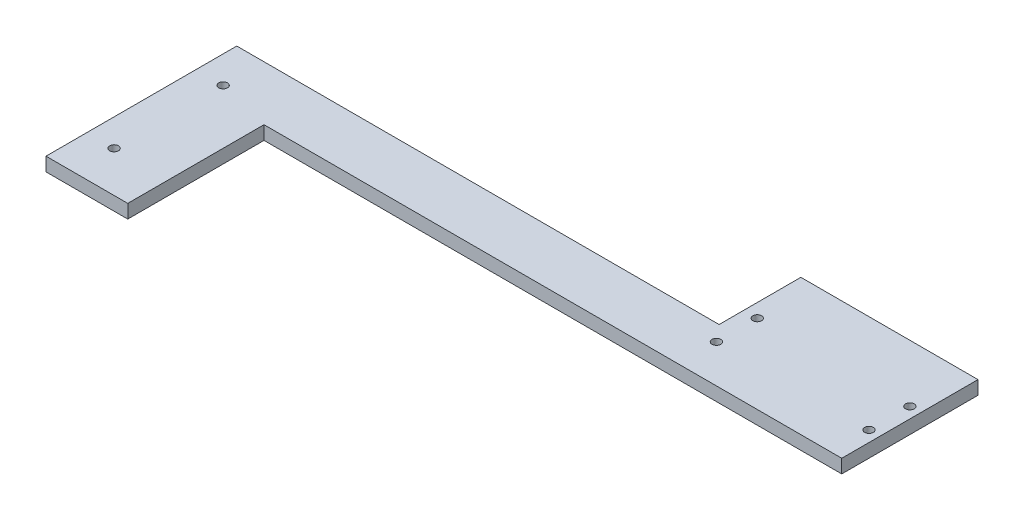
ISO-10303-21;
HEADER;
FILE_DESCRIPTION(('STEP AP214'),'2;1');
FILE_NAME('part.step','',(''),(''),'','','');
FILE_SCHEMA(('AUTOMOTIVE_DESIGN { 1 0 10303 214 1 1 1 1 }'));
ENDSEC;
DATA;
#1=APPLICATION_CONTEXT('core data for automotive mechanical design processes');
#2=APPLICATION_PROTOCOL_DEFINITION('international standard','automotive_design',2000,#1);
#3=PRODUCT_CONTEXT('',#1,'mechanical');
#4=PRODUCT('Part','Part','',(#3));
#5=PRODUCT_RELATED_PRODUCT_CATEGORY('part','',(#4));
#6=PRODUCT_DEFINITION_FORMATION('','',#4);
#7=PRODUCT_DEFINITION_CONTEXT('part definition',#1,'design');
#8=PRODUCT_DEFINITION('design','',#6,#7);
#9=PRODUCT_DEFINITION_SHAPE('','',#8);
#10=(LENGTH_UNIT() NAMED_UNIT(*) SI_UNIT(.MILLI.,.METRE.));
#11=(NAMED_UNIT(*) PLANE_ANGLE_UNIT() SI_UNIT($,.RADIAN.));
#12=(NAMED_UNIT(*) SI_UNIT($,.STERADIAN.) SOLID_ANGLE_UNIT());
#13=UNCERTAINTY_MEASURE_WITH_UNIT(LENGTH_MEASURE(1.E-05),#10,'distance_accuracy_value','');
#14=(GEOMETRIC_REPRESENTATION_CONTEXT(3) GLOBAL_UNCERTAINTY_ASSIGNED_CONTEXT((#13)) GLOBAL_UNIT_ASSIGNED_CONTEXT((#10,
#11,#12)) REPRESENTATION_CONTEXT('',''));
#15=CARTESIAN_POINT('',(0.,0.,0.));
#16=DIRECTION('',(0.,0.,1.));
#17=DIRECTION('',(1.,0.,0.));
#18=AXIS2_PLACEMENT_3D('',#15,#16,#17);
#19=CARTESIAN_POINT('',(0.,5.,0.));
#20=DIRECTION('',(0.,1.,0.));
#21=DIRECTION('',(0.,0.,1.));
#22=AXIS2_PLACEMENT_3D('',#19,#20,#21);
#23=PLANE('',#22);
#24=CARTESIAN_POINT('',(228.,5.,-29.));
#25=DIRECTION('',(0.,1.,0.));
#26=DIRECTION('',(0.,0.,1.));
#27=AXIS2_PLACEMENT_3D('',#24,#25,#26);
#28=CIRCLE('',#27,1.59999999999999);
#29=CARTESIAN_POINT('',(228.,5.,-27.4));
#30=VERTEX_POINT('',#29);
#31=EDGE_CURVE('E206',#30,#30,#28,.T.);
#32=ORIENTED_EDGE('',*,*,#31,.F.);
#33=EDGE_LOOP('',(#32));
#34=FACE_BOUND('',#33,.T.);
#35=CARTESIAN_POINT('',(0.,5.,-20.));
#36=DIRECTION('',(0.,1.,0.));
#37=DIRECTION('',(0.,0.,-1.));
#38=AXIS2_PLACEMENT_3D('',#35,#36,#37);
#39=CIRCLE('',#38,1.6);
#40=CARTESIAN_POINT('',(0.,5.,-21.6));
#41=VERTEX_POINT('',#40);
#42=EDGE_CURVE('E194',#41,#41,#39,.T.);
#43=ORIENTED_EDGE('',*,*,#42,.F.);
#44=EDGE_LOOP('',(#43));
#45=FACE_BOUND('',#44,.T.);
#46=CARTESIAN_POINT('',(0.,5.,20.));
#47=DIRECTION('',(0.,1.,0.));
#48=DIRECTION('',(0.,0.,1.));
#49=AXIS2_PLACEMENT_3D('',#46,#47,#48);
#50=CIRCLE('',#49,1.6);
#51=CARTESIAN_POINT('',(0.,5.,21.6));
#52=VERTEX_POINT('',#51);
#53=EDGE_CURVE('E136',#52,#52,#50,.T.);
#54=ORIENTED_EDGE('',*,*,#53,.F.);
#55=EDGE_LOOP('',(#54));
#56=FACE_BOUND('',#55,.T.);
#57=DIRECTION('',(-1.,0.,0.));
#58=VECTOR('',#57,1.);
#59=CARTESIAN_POINT('',(0.,5.,-35.));
#60=LINE('',#59,#58);
#61=CARTESIAN_POINT('',(167.,5.,-35.));
#62=VERTEX_POINT('',#61);
#63=CARTESIAN_POINT('',(-9.99999999999998,5.,-35.));
#64=VERTEX_POINT('',#63);
#65=EDGE_CURVE('E96',#62,#64,#60,.T.);
#66=ORIENTED_EDGE('',*,*,#65,.T.);
#67=DIRECTION('',(0.,0.,1.));
#68=VECTOR('',#67,1.);
#69=CARTESIAN_POINT('',(-9.99999999999998,5.,-35.));
#70=LINE('',#69,#68);
#71=CARTESIAN_POINT('',(-9.99999999999998,5.,35.));
#72=VERTEX_POINT('',#71);
#73=EDGE_CURVE('E169',#64,#72,#70,.T.);
#74=ORIENTED_EDGE('',*,*,#73,.T.);
#75=DIRECTION('',(1.,0.,0.));
#76=VECTOR('',#75,1.);
#77=CARTESIAN_POINT('',(-9.99999999999998,5.,35.));
#78=LINE('',#77,#76);
#79=CARTESIAN_POINT('',(20.,5.,35.));
#80=VERTEX_POINT('',#79);
#81=EDGE_CURVE('E165',#72,#80,#78,.T.);
#82=ORIENTED_EDGE('',*,*,#81,.T.);
#83=DIRECTION('',(0.,0.,-1.));
#84=VECTOR('',#83,1.);
#85=CARTESIAN_POINT('',(20.,5.,35.));
#86=LINE('',#85,#84);
#87=CARTESIAN_POINT('',(20.,5.,-15.));
#88=VERTEX_POINT('',#87);
#89=EDGE_CURVE('E179',#80,#88,#86,.T.);
#90=ORIENTED_EDGE('',*,*,#89,.T.);
#91=DIRECTION('',(1.,0.,0.));
#92=VECTOR('',#91,1.);
#93=CARTESIAN_POINT('',(20.,5.,-15.));
#94=LINE('',#93,#92);
#95=CARTESIAN_POINT('',(232.,5.,-15.));
#96=VERTEX_POINT('',#95);
#97=EDGE_CURVE('E116',#88,#96,#94,.T.);
#98=ORIENTED_EDGE('',*,*,#97,.T.);
#99=DIRECTION('',(0.,0.,-1.));
#100=VECTOR('',#99,1.);
#101=CARTESIAN_POINT('',(232.,5.,-15.));
#102=LINE('',#101,#100);
#103=CARTESIAN_POINT('',(232.,5.,-65.));
#104=VERTEX_POINT('',#103);
#105=EDGE_CURVE('E110',#96,#104,#102,.T.);
#106=ORIENTED_EDGE('',*,*,#105,.T.);
#107=DIRECTION('',(-1.,0.,0.));
#108=VECTOR('',#107,1.);
#109=CARTESIAN_POINT('',(167.,5.,-65.));
#110=LINE('',#109,#108);
#111=CARTESIAN_POINT('',(167.,5.,-65.));
#112=VERTEX_POINT('',#111);
#113=EDGE_CURVE('E114',#104,#112,#110,.T.);
#114=ORIENTED_EDGE('',*,*,#113,.T.);
#115=DIRECTION('',(0.,0.,1.));
#116=VECTOR('',#115,1.);
#117=CARTESIAN_POINT('',(167.,5.,-35.));
#118=LINE('',#117,#116);
#119=EDGE_CURVE('E54',#112,#62,#118,.T.);
#120=ORIENTED_EDGE('',*,*,#119,.T.);
#121=EDGE_LOOP('',(#66,#74,#82,#90,#98,#106,#114,#120));
#122=FACE_BOUND('',#121,.T.);
#123=CARTESIAN_POINT('',(172.,5.,-29.));
#124=DIRECTION('',(0.,1.,0.));
#125=DIRECTION('',(0.,0.,1.));
#126=AXIS2_PLACEMENT_3D('',#123,#124,#125);
#127=CIRCLE('',#126,1.59999999999999);
#128=CARTESIAN_POINT('',(172.,5.,-27.4));
#129=VERTEX_POINT('',#128);
#130=EDGE_CURVE('E188',#129,#129,#127,.T.);
#131=ORIENTED_EDGE('',*,*,#130,.F.);
#132=EDGE_LOOP('',(#131));
#133=FACE_BOUND('',#132,.T.);
#134=CARTESIAN_POINT('',(172.,5.,-44.));
#135=DIRECTION('',(0.,1.,0.));
#136=DIRECTION('',(0.,0.,1.));
#137=AXIS2_PLACEMENT_3D('',#134,#135,#136);
#138=CIRCLE('',#137,1.59999999999999);
#139=CARTESIAN_POINT('',(172.,5.,-42.4));
#140=VERTEX_POINT('',#139);
#141=EDGE_CURVE('E200',#140,#140,#138,.T.);
#142=ORIENTED_EDGE('',*,*,#141,.F.);
#143=EDGE_LOOP('',(#142));
#144=FACE_BOUND('',#143,.T.);
#145=CARTESIAN_POINT('',(228.,5.,-44.));
#146=DIRECTION('',(0.,1.,0.));
#147=DIRECTION('',(0.,0.,1.));
#148=AXIS2_PLACEMENT_3D('',#145,#146,#147);
#149=CIRCLE('',#148,1.59999999999999);
#150=CARTESIAN_POINT('',(228.,5.,-42.4));
#151=VERTEX_POINT('',#150);
#152=EDGE_CURVE('E212',#151,#151,#149,.T.);
#153=ORIENTED_EDGE('',*,*,#152,.F.);
#154=EDGE_LOOP('',(#153));
#155=FACE_BOUND('',#154,.T.);
#156=ADVANCED_FACE('F37',(#34,#45,#56,#122,#133,#144,#155),#23,.T.);
#157=CARTESIAN_POINT('',(0.,0.,0.));
#158=DIRECTION('',(0.,1.,0.));
#159=DIRECTION('',(0.,0.,1.));
#160=AXIS2_PLACEMENT_3D('',#157,#158,#159);
#161=PLANE('',#160);
#162=DIRECTION('',(-1.,0.,0.));
#163=VECTOR('',#162,1.);
#164=CARTESIAN_POINT('',(-9.99999999999998,0.,-35.));
#165=LINE('',#164,#163);
#166=CARTESIAN_POINT('',(167.,0.,-35.));
#167=VERTEX_POINT('',#166);
#168=CARTESIAN_POINT('',(-9.99999999999998,0.,-35.));
#169=VERTEX_POINT('',#168);
#170=EDGE_CURVE('E90',#167,#169,#165,.T.);
#171=ORIENTED_EDGE('',*,*,#170,.F.);
#172=DIRECTION('',(0.,0.,1.));
#173=VECTOR('',#172,1.);
#174=CARTESIAN_POINT('',(167.,0.,-35.));
#175=LINE('',#174,#173);
#176=CARTESIAN_POINT('',(167.,0.,-65.));
#177=VERTEX_POINT('',#176);
#178=EDGE_CURVE('E148',#177,#167,#175,.T.);
#179=ORIENTED_EDGE('',*,*,#178,.F.);
#180=DIRECTION('',(-1.,0.,0.));
#181=VECTOR('',#180,1.);
#182=CARTESIAN_POINT('',(167.,0.,-65.));
#183=LINE('',#182,#181);
#184=CARTESIAN_POINT('',(232.,0.,-65.));
#185=VERTEX_POINT('',#184);
#186=EDGE_CURVE('E83',#185,#177,#183,.T.);
#187=ORIENTED_EDGE('',*,*,#186,.F.);
#188=DIRECTION('',(0.,0.,-1.));
#189=VECTOR('',#188,1.);
#190=CARTESIAN_POINT('',(232.,0.,-15.));
#191=LINE('',#190,#189);
#192=CARTESIAN_POINT('',(232.,0.,-15.));
#193=VERTEX_POINT('',#192);
#194=EDGE_CURVE('E124',#193,#185,#191,.T.);
#195=ORIENTED_EDGE('',*,*,#194,.F.);
#196=DIRECTION('',(1.,0.,0.));
#197=VECTOR('',#196,1.);
#198=CARTESIAN_POINT('',(20.,0.,-15.));
#199=LINE('',#198,#197);
#200=CARTESIAN_POINT('',(20.,0.,-15.));
#201=VERTEX_POINT('',#200);
#202=EDGE_CURVE('E144',#201,#193,#199,.T.);
#203=ORIENTED_EDGE('',*,*,#202,.F.);
#204=DIRECTION('',(0.,0.,-1.));
#205=VECTOR('',#204,1.);
#206=CARTESIAN_POINT('',(20.,0.,0.));
#207=LINE('',#206,#205);
#208=CARTESIAN_POINT('',(20.,0.,35.));
#209=VERTEX_POINT('',#208);
#210=EDGE_CURVE('E142',#209,#201,#207,.T.);
#211=ORIENTED_EDGE('',*,*,#210,.F.);
#212=DIRECTION('',(1.,0.,0.));
#213=VECTOR('',#212,1.);
#214=CARTESIAN_POINT('',(0.,0.,35.));
#215=LINE('',#214,#213);
#216=CARTESIAN_POINT('',(-9.99999999999998,0.,35.));
#217=VERTEX_POINT('',#216);
#218=EDGE_CURVE('E139',#217,#209,#215,.T.);
#219=ORIENTED_EDGE('',*,*,#218,.F.);
#220=DIRECTION('',(0.,0.,1.));
#221=VECTOR('',#220,1.);
#222=CARTESIAN_POINT('',(-9.99999999999998,0.,-35.));
#223=LINE('',#222,#221);
#224=EDGE_CURVE('E135',#169,#217,#223,.T.);
#225=ORIENTED_EDGE('',*,*,#224,.F.);
#226=EDGE_LOOP('',(#171,#179,#187,#195,#203,#211,#219,#225));
#227=FACE_BOUND('',#226,.T.);
#228=CARTESIAN_POINT('',(0.,0.,20.));
#229=DIRECTION('',(0.,1.,0.));
#230=DIRECTION('',(0.,0.,1.));
#231=AXIS2_PLACEMENT_3D('',#228,#229,#230);
#232=CIRCLE('',#231,1.6);
#233=CARTESIAN_POINT('',(0.,0.,21.6));
#234=VERTEX_POINT('',#233);
#235=EDGE_CURVE('E185',#234,#234,#232,.T.);
#236=ORIENTED_EDGE('',*,*,#235,.T.);
#237=EDGE_LOOP('',(#236));
#238=FACE_BOUND('',#237,.T.);
#239=CARTESIAN_POINT('',(172.,0.,-29.));
#240=DIRECTION('',(0.,1.,0.));
#241=DIRECTION('',(0.,0.,1.));
#242=AXIS2_PLACEMENT_3D('',#239,#240,#241);
#243=CIRCLE('',#242,1.59999999999999);
#244=CARTESIAN_POINT('',(172.,0.,-27.4));
#245=VERTEX_POINT('',#244);
#246=EDGE_CURVE('E191',#245,#245,#243,.T.);
#247=ORIENTED_EDGE('',*,*,#246,.T.);
#248=EDGE_LOOP('',(#247));
#249=FACE_BOUND('',#248,.T.);
#250=CARTESIAN_POINT('',(0.,0.,-20.));
#251=DIRECTION('',(0.,1.,0.));
#252=DIRECTION('',(0.,0.,-1.));
#253=AXIS2_PLACEMENT_3D('',#250,#251,#252);
#254=CIRCLE('',#253,1.6);
#255=CARTESIAN_POINT('',(0.,0.,-21.6));
#256=VERTEX_POINT('',#255);
#257=EDGE_CURVE('E197',#256,#256,#254,.T.);
#258=ORIENTED_EDGE('',*,*,#257,.T.);
#259=EDGE_LOOP('',(#258));
#260=FACE_BOUND('',#259,.T.);
#261=CARTESIAN_POINT('',(172.,0.,-44.));
#262=DIRECTION('',(0.,1.,0.));
#263=DIRECTION('',(0.,0.,1.));
#264=AXIS2_PLACEMENT_3D('',#261,#262,#263);
#265=CIRCLE('',#264,1.59999999999999);
#266=CARTESIAN_POINT('',(172.,0.,-42.4));
#267=VERTEX_POINT('',#266);
#268=EDGE_CURVE('E203',#267,#267,#265,.T.);
#269=ORIENTED_EDGE('',*,*,#268,.T.);
#270=EDGE_LOOP('',(#269));
#271=FACE_BOUND('',#270,.T.);
#272=CARTESIAN_POINT('',(228.,0.,-29.));
#273=DIRECTION('',(0.,1.,0.));
#274=DIRECTION('',(0.,0.,1.));
#275=AXIS2_PLACEMENT_3D('',#272,#273,#274);
#276=CIRCLE('',#275,1.59999999999999);
#277=CARTESIAN_POINT('',(228.,0.,-27.4));
#278=VERTEX_POINT('',#277);
#279=EDGE_CURVE('E209',#278,#278,#276,.T.);
#280=ORIENTED_EDGE('',*,*,#279,.T.);
#281=EDGE_LOOP('',(#280));
#282=FACE_BOUND('',#281,.T.);
#283=CARTESIAN_POINT('',(228.,0.,-44.));
#284=DIRECTION('',(0.,1.,0.));
#285=DIRECTION('',(0.,0.,1.));
#286=AXIS2_PLACEMENT_3D('',#283,#284,#285);
#287=CIRCLE('',#286,1.59999999999999);
#288=CARTESIAN_POINT('',(228.,0.,-42.4));
#289=VERTEX_POINT('',#288);
#290=EDGE_CURVE('E215',#289,#289,#287,.T.);
#291=ORIENTED_EDGE('',*,*,#290,.T.);
#292=EDGE_LOOP('',(#291));
#293=FACE_BOUND('',#292,.T.);
#294=ADVANCED_FACE('F170',(#227,#238,#249,#260,#271,#282,#293),#161,.F.);
#295=CARTESIAN_POINT('',(-9.99999999999998,5.,-35.));
#296=DIRECTION('',(0.,0.,1.));
#297=DIRECTION('',(1.,0.,0.));
#298=AXIS2_PLACEMENT_3D('',#295,#296,#297);
#299=PLANE('',#298);
#300=ORIENTED_EDGE('',*,*,#170,.T.);
#301=DIRECTION('',(0.,-1.,0.));
#302=VECTOR('',#301,1.);
#303=CARTESIAN_POINT('',(-9.99999999999998,5.,-35.));
#304=LINE('',#303,#302);
#305=EDGE_CURVE('E11',#64,#169,#304,.T.);
#306=ORIENTED_EDGE('',*,*,#305,.F.);
#307=ORIENTED_EDGE('',*,*,#65,.F.);
#308=DIRECTION('',(0.,-1.,0.));
#309=VECTOR('',#308,1.);
#310=CARTESIAN_POINT('',(167.,5.,-35.));
#311=LINE('',#310,#309);
#312=EDGE_CURVE('E130',#62,#167,#311,.T.);
#313=ORIENTED_EDGE('',*,*,#312,.T.);
#314=EDGE_LOOP('',(#300,#306,#307,#313));
#315=FACE_BOUND('',#314,.T.);
#316=ADVANCED_FACE('F39',(#315),#299,.F.);
#317=CARTESIAN_POINT('',(-9.99999999999998,5.,-35.));
#318=DIRECTION('',(1.,0.,0.));
#319=DIRECTION('',(0.,0.,-1.));
#320=AXIS2_PLACEMENT_3D('',#317,#318,#319);
#321=PLANE('',#320);
#322=ORIENTED_EDGE('',*,*,#224,.T.);
#323=DIRECTION('',(0.,-1.,0.));
#324=VECTOR('',#323,1.);
#325=CARTESIAN_POINT('',(-9.99999999999998,5.,35.));
#326=LINE('',#325,#324);
#327=EDGE_CURVE('E46',#72,#217,#326,.T.);
#328=ORIENTED_EDGE('',*,*,#327,.F.);
#329=ORIENTED_EDGE('',*,*,#73,.F.);
#330=ORIENTED_EDGE('',*,*,#305,.T.);
#331=EDGE_LOOP('',(#322,#328,#329,#330));
#332=FACE_BOUND('',#331,.T.);
#333=ADVANCED_FACE('F168',(#332),#321,.F.);
#334=CARTESIAN_POINT('',(0.,5.,35.));
#335=DIRECTION('',(0.,0.,-1.));
#336=DIRECTION('',(-1.,0.,0.));
#337=AXIS2_PLACEMENT_3D('',#334,#335,#336);
#338=PLANE('',#337);
#339=ORIENTED_EDGE('',*,*,#218,.T.);
#340=DIRECTION('',(0.,-1.,0.));
#341=VECTOR('',#340,1.);
#342=CARTESIAN_POINT('',(20.,5.,35.));
#343=LINE('',#342,#341);
#344=EDGE_CURVE('E157',#80,#209,#343,.T.);
#345=ORIENTED_EDGE('',*,*,#344,.F.);
#346=ORIENTED_EDGE('',*,*,#81,.F.);
#347=ORIENTED_EDGE('',*,*,#327,.T.);
#348=EDGE_LOOP('',(#339,#345,#346,#347));
#349=FACE_BOUND('',#348,.T.);
#350=ADVANCED_FACE('F163',(#349),#338,.F.);
#351=CARTESIAN_POINT('',(20.,5.,0.));
#352=DIRECTION('',(-1.,0.,0.));
#353=DIRECTION('',(0.,0.,1.));
#354=AXIS2_PLACEMENT_3D('',#351,#352,#353);
#355=PLANE('',#354);
#356=ORIENTED_EDGE('',*,*,#210,.T.);
#357=DIRECTION('',(0.,-1.,0.));
#358=VECTOR('',#357,1.);
#359=CARTESIAN_POINT('',(20.,5.,-15.));
#360=LINE('',#359,#358);
#361=EDGE_CURVE('E154',#88,#201,#360,.T.);
#362=ORIENTED_EDGE('',*,*,#361,.F.);
#363=ORIENTED_EDGE('',*,*,#89,.F.);
#364=ORIENTED_EDGE('',*,*,#344,.T.);
#365=EDGE_LOOP('',(#356,#362,#363,#364));
#366=FACE_BOUND('',#365,.T.);
#367=ADVANCED_FACE('F175',(#366),#355,.F.);
#368=CARTESIAN_POINT('',(20.,5.,-15.));
#369=DIRECTION('',(0.,0.,-1.));
#370=DIRECTION('',(-1.,0.,0.));
#371=AXIS2_PLACEMENT_3D('',#368,#369,#370);
#372=PLANE('',#371);
#373=ORIENTED_EDGE('',*,*,#202,.T.);
#374=DIRECTION('',(0.,-1.,0.));
#375=VECTOR('',#374,1.);
#376=CARTESIAN_POINT('',(232.,5.,-15.));
#377=LINE('',#376,#375);
#378=EDGE_CURVE('E125',#96,#193,#377,.T.);
#379=ORIENTED_EDGE('',*,*,#378,.F.);
#380=ORIENTED_EDGE('',*,*,#97,.F.);
#381=ORIENTED_EDGE('',*,*,#361,.T.);
#382=EDGE_LOOP('',(#373,#379,#380,#381));
#383=FACE_BOUND('',#382,.T.);
#384=ADVANCED_FACE('F178',(#383),#372,.F.);
#385=CARTESIAN_POINT('',(232.,5.,-15.));
#386=DIRECTION('',(-1.,0.,0.));
#387=DIRECTION('',(0.,0.,1.));
#388=AXIS2_PLACEMENT_3D('',#385,#386,#387);
#389=PLANE('',#388);
#390=ORIENTED_EDGE('',*,*,#194,.T.);
#391=DIRECTION('',(0.,-1.,0.));
#392=VECTOR('',#391,1.);
#393=CARTESIAN_POINT('',(232.,5.,-65.));
#394=LINE('',#393,#392);
#395=EDGE_CURVE('E121',#104,#185,#394,.T.);
#396=ORIENTED_EDGE('',*,*,#395,.F.);
#397=ORIENTED_EDGE('',*,*,#105,.F.);
#398=ORIENTED_EDGE('',*,*,#378,.T.);
#399=EDGE_LOOP('',(#390,#396,#397,#398));
#400=FACE_BOUND('',#399,.T.);
#401=ADVANCED_FACE('F122',(#400),#389,.F.);
#402=CARTESIAN_POINT('',(167.,5.,-65.));
#403=DIRECTION('',(0.,0.,1.));
#404=DIRECTION('',(1.,0.,0.));
#405=AXIS2_PLACEMENT_3D('',#402,#403,#404);
#406=PLANE('',#405);
#407=ORIENTED_EDGE('',*,*,#186,.T.);
#408=DIRECTION('',(0.,-1.,0.));
#409=VECTOR('',#408,1.);
#410=CARTESIAN_POINT('',(167.,5.,-65.));
#411=LINE('',#410,#409);
#412=EDGE_CURVE('E126',#112,#177,#411,.T.);
#413=ORIENTED_EDGE('',*,*,#412,.F.);
#414=ORIENTED_EDGE('',*,*,#113,.F.);
#415=ORIENTED_EDGE('',*,*,#395,.T.);
#416=EDGE_LOOP('',(#407,#413,#414,#415));
#417=FACE_BOUND('',#416,.T.);
#418=ADVANCED_FACE('F128',(#417),#406,.F.);
#419=CARTESIAN_POINT('',(167.,5.,-35.));
#420=DIRECTION('',(1.,0.,0.));
#421=DIRECTION('',(0.,0.,-1.));
#422=AXIS2_PLACEMENT_3D('',#419,#420,#421);
#423=PLANE('',#422);
#424=ORIENTED_EDGE('',*,*,#178,.T.);
#425=ORIENTED_EDGE('',*,*,#312,.F.);
#426=ORIENTED_EDGE('',*,*,#119,.F.);
#427=ORIENTED_EDGE('',*,*,#412,.T.);
#428=EDGE_LOOP('',(#424,#425,#426,#427));
#429=FACE_BOUND('',#428,.T.);
#430=ADVANCED_FACE('F237',(#429),#423,.F.);
#431=CARTESIAN_POINT('',(0.,5.,20.));
#432=DIRECTION('',(0.,-1.,0.));
#433=DIRECTION('',(0.,0.,-1.));
#434=AXIS2_PLACEMENT_3D('',#431,#432,#433);
#435=CYLINDRICAL_SURFACE('',#434,1.6);
#436=ORIENTED_EDGE('',*,*,#53,.T.);
#437=EDGE_LOOP('',(#436));
#438=FACE_BOUND('',#437,.T.);
#439=ORIENTED_EDGE('',*,*,#235,.F.);
#440=EDGE_LOOP('',(#439));
#441=FACE_BOUND('',#440,.T.);
#442=ADVANCED_FACE('F234',(#438,#441),#435,.F.);
#443=CARTESIAN_POINT('',(172.,5.,-29.));
#444=DIRECTION('',(0.,-1.,0.));
#445=DIRECTION('',(0.,0.,-1.));
#446=AXIS2_PLACEMENT_3D('',#443,#444,#445);
#447=CYLINDRICAL_SURFACE('',#446,1.59999999999999);
#448=ORIENTED_EDGE('',*,*,#130,.T.);
#449=EDGE_LOOP('',(#448));
#450=FACE_BOUND('',#449,.T.);
#451=ORIENTED_EDGE('',*,*,#246,.F.);
#452=EDGE_LOOP('',(#451));
#453=FACE_BOUND('',#452,.T.);
#454=ADVANCED_FACE('F320',(#450,#453),#447,.F.);
#455=CARTESIAN_POINT('',(0.,5.,-20.));
#456=DIRECTION('',(0.,-1.,0.));
#457=DIRECTION('',(0.,0.,-1.));
#458=AXIS2_PLACEMENT_3D('',#455,#456,#457);
#459=CYLINDRICAL_SURFACE('',#458,1.6);
#460=ORIENTED_EDGE('',*,*,#42,.T.);
#461=EDGE_LOOP('',(#460));
#462=FACE_BOUND('',#461,.T.);
#463=ORIENTED_EDGE('',*,*,#257,.F.);
#464=EDGE_LOOP('',(#463));
#465=FACE_BOUND('',#464,.T.);
#466=ADVANCED_FACE('F328',(#462,#465),#459,.F.);
#467=CARTESIAN_POINT('',(172.,5.,-44.));
#468=DIRECTION('',(0.,-1.,0.));
#469=DIRECTION('',(0.,0.,-1.));
#470=AXIS2_PLACEMENT_3D('',#467,#468,#469);
#471=CYLINDRICAL_SURFACE('',#470,1.59999999999999);
#472=ORIENTED_EDGE('',*,*,#141,.T.);
#473=EDGE_LOOP('',(#472));
#474=FACE_BOUND('',#473,.T.);
#475=ORIENTED_EDGE('',*,*,#268,.F.);
#476=EDGE_LOOP('',(#475));
#477=FACE_BOUND('',#476,.T.);
#478=ADVANCED_FACE('F336',(#474,#477),#471,.F.);
#479=CARTESIAN_POINT('',(228.,5.,-29.));
#480=DIRECTION('',(0.,-1.,0.));
#481=DIRECTION('',(0.,0.,-1.));
#482=AXIS2_PLACEMENT_3D('',#479,#480,#481);
#483=CYLINDRICAL_SURFACE('',#482,1.59999999999999);
#484=ORIENTED_EDGE('',*,*,#31,.T.);
#485=EDGE_LOOP('',(#484));
#486=FACE_BOUND('',#485,.T.);
#487=ORIENTED_EDGE('',*,*,#279,.F.);
#488=EDGE_LOOP('',(#487));
#489=FACE_BOUND('',#488,.T.);
#490=ADVANCED_FACE('F345',(#486,#489),#483,.F.);
#491=CARTESIAN_POINT('',(228.,5.,-44.));
#492=DIRECTION('',(0.,-1.,0.));
#493=DIRECTION('',(0.,0.,-1.));
#494=AXIS2_PLACEMENT_3D('',#491,#492,#493);
#495=CYLINDRICAL_SURFACE('',#494,1.59999999999999);
#496=ORIENTED_EDGE('',*,*,#152,.T.);
#497=EDGE_LOOP('',(#496));
#498=FACE_BOUND('',#497,.T.);
#499=ORIENTED_EDGE('',*,*,#290,.F.);
#500=EDGE_LOOP('',(#499));
#501=FACE_BOUND('',#500,.T.);
#502=ADVANCED_FACE('F221',(#498,#501),#495,.F.);
#503=CLOSED_SHELL('',(#156,#294,#316,#333,#350,#367,#384,#401,#418,#430,#442,#454,#466,#478,
#490,#502));
#504=MANIFOLD_SOLID_BREP('B2',#503);
#505=ADVANCED_BREP_SHAPE_REPRESENTATION('',(#18,#504),#14);
#506=SHAPE_DEFINITION_REPRESENTATION(#9,#505);
ENDSEC;
END-ISO-10303-21;
